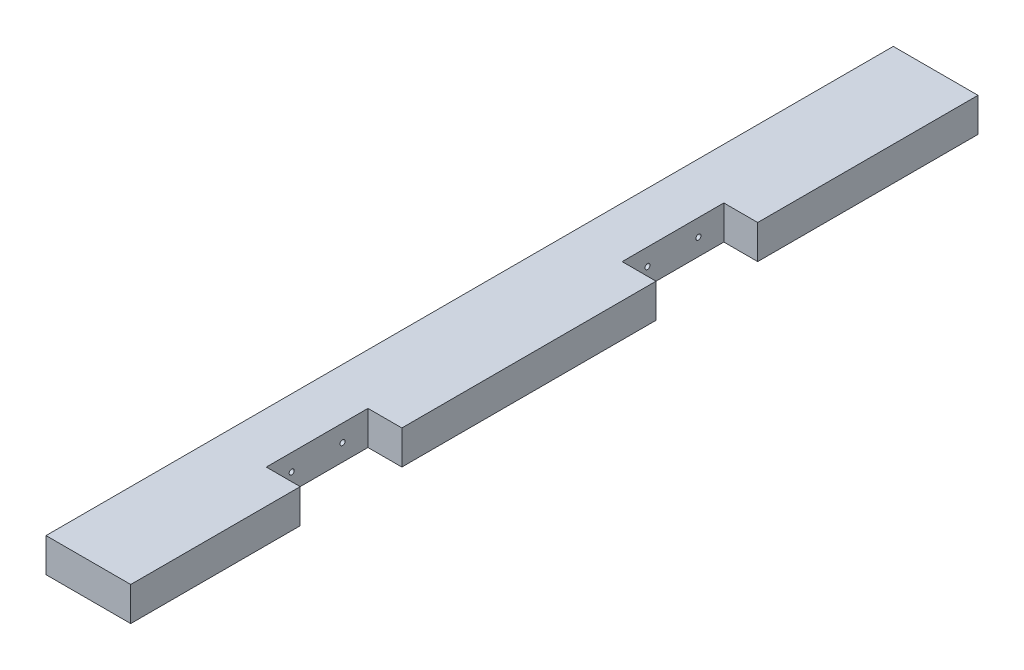
ISO-10303-21;
HEADER;
FILE_DESCRIPTION(('STEP AP214'),'2;1');
FILE_NAME('part.step','',(''),(''),'','','');
FILE_SCHEMA(('AUTOMOTIVE_DESIGN { 1 0 10303 214 1 1 1 1 }'));
ENDSEC;
DATA;
#1=APPLICATION_CONTEXT('core data for automotive mechanical design processes');
#2=APPLICATION_PROTOCOL_DEFINITION('international standard','automotive_design',2000,#1);
#3=PRODUCT_CONTEXT('',#1,'mechanical');
#4=PRODUCT('Part','Part','',(#3));
#5=PRODUCT_RELATED_PRODUCT_CATEGORY('part','',(#4));
#6=PRODUCT_DEFINITION_FORMATION('','',#4);
#7=PRODUCT_DEFINITION_CONTEXT('part definition',#1,'design');
#8=PRODUCT_DEFINITION('design','',#6,#7);
#9=PRODUCT_DEFINITION_SHAPE('','',#8);
#10=(LENGTH_UNIT() NAMED_UNIT(*) SI_UNIT(.MILLI.,.METRE.));
#11=(NAMED_UNIT(*) PLANE_ANGLE_UNIT() SI_UNIT($,.RADIAN.));
#12=(NAMED_UNIT(*) SI_UNIT($,.STERADIAN.) SOLID_ANGLE_UNIT());
#13=UNCERTAINTY_MEASURE_WITH_UNIT(LENGTH_MEASURE(1.E-05),#10,'distance_accuracy_value','');
#14=(GEOMETRIC_REPRESENTATION_CONTEXT(3) GLOBAL_UNCERTAINTY_ASSIGNED_CONTEXT((#13)) GLOBAL_UNIT_ASSIGNED_CONTEXT((#10,
#11,#12)) REPRESENTATION_CONTEXT('',''));
#15=CARTESIAN_POINT('',(0.,0.,0.));
#16=DIRECTION('',(0.,0.,1.));
#17=DIRECTION('',(1.,0.,0.));
#18=AXIS2_PLACEMENT_3D('',#15,#16,#17);
#19=CARTESIAN_POINT('',(25.,10.,500.));
#20=DIRECTION('',(-1.,0.,0.));
#21=DIRECTION('',(0.,-1.,0.));
#22=AXIS2_PLACEMENT_3D('',#19,#20,#21);
#23=PLANE('',#22);
#24=DIRECTION('',(0.,0.,-1.));
#25=VECTOR('',#24,1.);
#26=CARTESIAN_POINT('',(25.,-10.,500.));
#27=LINE('',#26,#25);
#28=CARTESIAN_POINT('',(25.,-10.,340.));
#29=VERTEX_POINT('',#28);
#30=CARTESIAN_POINT('',(25.,-10.,190.));
#31=VERTEX_POINT('',#30);
#32=EDGE_CURVE('E144',#29,#31,#27,.T.);
#33=ORIENTED_EDGE('',*,*,#32,.T.);
#34=DIRECTION('',(0.,1.,0.));
#35=VECTOR('',#34,1.);
#36=CARTESIAN_POINT('',(25.,-10.,190.));
#37=LINE('',#36,#35);
#38=CARTESIAN_POINT('',(25.,10.,190.));
#39=VERTEX_POINT('',#38);
#40=EDGE_CURVE('E183',#31,#39,#37,.T.);
#41=ORIENTED_EDGE('',*,*,#40,.T.);
#42=DIRECTION('',(0.,0.,-1.));
#43=VECTOR('',#42,1.);
#44=CARTESIAN_POINT('',(25.,10.,500.));
#45=LINE('',#44,#43);
#46=CARTESIAN_POINT('',(25.,10.,340.));
#47=VERTEX_POINT('',#46);
#48=EDGE_CURVE('E40',#47,#39,#45,.T.);
#49=ORIENTED_EDGE('',*,*,#48,.F.);
#50=DIRECTION('',(0.,1.,0.));
#51=VECTOR('',#50,1.);
#52=CARTESIAN_POINT('',(25.,-10.,340.));
#53=LINE('',#52,#51);
#54=EDGE_CURVE('E181',#29,#47,#53,.T.);
#55=ORIENTED_EDGE('',*,*,#54,.F.);
#56=EDGE_LOOP('',(#33,#41,#49,#55));
#57=FACE_BOUND('',#56,.T.);
#58=ADVANCED_FACE('F32',(#57),#23,.F.);
#59=CARTESIAN_POINT('',(25.,-10.,500.));
#60=VERTEX_POINT('',#59);
#61=CARTESIAN_POINT('',(25.,-10.,400.));
#62=VERTEX_POINT('',#61);
#63=EDGE_CURVE('E147',#60,#62,#27,.T.);
#64=ORIENTED_EDGE('',*,*,#63,.T.);
#65=DIRECTION('',(0.,1.,0.));
#66=VECTOR('',#65,1.);
#67=CARTESIAN_POINT('',(25.,-10.,400.));
#68=LINE('',#67,#66);
#69=CARTESIAN_POINT('',(25.,10.,400.));
#70=VERTEX_POINT('',#69);
#71=EDGE_CURVE('E207',#62,#70,#68,.T.);
#72=ORIENTED_EDGE('',*,*,#71,.T.);
#73=CARTESIAN_POINT('',(25.,10.,500.));
#74=VERTEX_POINT('',#73);
#75=EDGE_CURVE('E11',#74,#70,#45,.T.);
#76=ORIENTED_EDGE('',*,*,#75,.F.);
#77=DIRECTION('',(0.,1.,0.));
#78=VECTOR('',#77,1.);
#79=CARTESIAN_POINT('',(25.,10.,500.));
#80=LINE('',#79,#78);
#81=EDGE_CURVE('E215',#60,#74,#80,.T.);
#82=ORIENTED_EDGE('',*,*,#81,.F.);
#83=EDGE_LOOP('',(#64,#72,#76,#82));
#84=FACE_BOUND('',#83,.T.);
#85=ADVANCED_FACE('F231',(#84),#23,.F.);
#86=CARTESIAN_POINT('',(25.,10.,130.));
#87=VERTEX_POINT('',#86);
#88=CARTESIAN_POINT('',(25.,10.,0.));
#89=VERTEX_POINT('',#88);
#90=EDGE_CURVE('E41',#87,#89,#45,.T.);
#91=ORIENTED_EDGE('',*,*,#90,.F.);
#92=DIRECTION('',(0.,1.,0.));
#93=VECTOR('',#92,1.);
#94=CARTESIAN_POINT('',(25.,-10.,130.));
#95=LINE('',#94,#93);
#96=CARTESIAN_POINT('',(25.,-10.,130.));
#97=VERTEX_POINT('',#96);
#98=EDGE_CURVE('E125',#97,#87,#95,.T.);
#99=ORIENTED_EDGE('',*,*,#98,.F.);
#100=CARTESIAN_POINT('',(25.,-10.,0.));
#101=VERTEX_POINT('',#100);
#102=EDGE_CURVE('E135',#97,#101,#27,.T.);
#103=ORIENTED_EDGE('',*,*,#102,.T.);
#104=DIRECTION('',(0.,1.,0.));
#105=VECTOR('',#104,1.);
#106=CARTESIAN_POINT('',(25.,10.,0.));
#107=LINE('',#106,#105);
#108=EDGE_CURVE('E209',#101,#89,#107,.T.);
#109=ORIENTED_EDGE('',*,*,#108,.T.);
#110=EDGE_LOOP('',(#91,#99,#103,#109));
#111=FACE_BOUND('',#110,.T.);
#112=ADVANCED_FACE('F34',(#111),#23,.F.);
#113=CARTESIAN_POINT('',(-25.,10.,500.));
#114=DIRECTION('',(0.,-1.,0.));
#115=DIRECTION('',(0.,0.,-1.));
#116=AXIS2_PLACEMENT_3D('',#113,#114,#115);
#117=PLANE('',#116);
#118=ORIENTED_EDGE('',*,*,#48,.T.);
#119=DIRECTION('',(1.,0.,0.));
#120=VECTOR('',#119,1.);
#121=CARTESIAN_POINT('',(25.,10.,190.));
#122=LINE('',#121,#120);
#123=CARTESIAN_POINT('',(4.99999999999998,10.,190.));
#124=VERTEX_POINT('',#123);
#125=EDGE_CURVE('E130',#124,#39,#122,.T.);
#126=ORIENTED_EDGE('',*,*,#125,.F.);
#127=DIRECTION('',(0.,0.,1.));
#128=VECTOR('',#127,1.);
#129=CARTESIAN_POINT('',(4.99999999999998,10.,130.));
#130=LINE('',#129,#128);
#131=CARTESIAN_POINT('',(4.99999999999998,10.,130.));
#132=VERTEX_POINT('',#131);
#133=EDGE_CURVE('E243',#132,#124,#130,.T.);
#134=ORIENTED_EDGE('',*,*,#133,.F.);
#135=DIRECTION('',(-1.,0.,0.));
#136=VECTOR('',#135,1.);
#137=CARTESIAN_POINT('',(25.,10.,130.));
#138=LINE('',#137,#136);
#139=EDGE_CURVE('E242',#87,#132,#138,.T.);
#140=ORIENTED_EDGE('',*,*,#139,.F.);
#141=ORIENTED_EDGE('',*,*,#90,.T.);
#142=DIRECTION('',(-1.,0.,0.));
#143=VECTOR('',#142,1.);
#144=CARTESIAN_POINT('',(-25.,10.,0.));
#145=LINE('',#144,#143);
#146=CARTESIAN_POINT('',(-25.,10.,0.));
#147=VERTEX_POINT('',#146);
#148=EDGE_CURVE('E222',#89,#147,#145,.T.);
#149=ORIENTED_EDGE('',*,*,#148,.T.);
#150=DIRECTION('',(0.,0.,-1.));
#151=VECTOR('',#150,1.);
#152=CARTESIAN_POINT('',(-25.,10.,500.));
#153=LINE('',#152,#151);
#154=CARTESIAN_POINT('',(-25.,10.,500.));
#155=VERTEX_POINT('',#154);
#156=EDGE_CURVE('E159',#155,#147,#153,.T.);
#157=ORIENTED_EDGE('',*,*,#156,.F.);
#158=DIRECTION('',(-1.,0.,0.));
#159=VECTOR('',#158,1.);
#160=CARTESIAN_POINT('',(-25.,10.,500.));
#161=LINE('',#160,#159);
#162=EDGE_CURVE('E218',#74,#155,#161,.T.);
#163=ORIENTED_EDGE('',*,*,#162,.F.);
#164=ORIENTED_EDGE('',*,*,#75,.T.);
#165=DIRECTION('',(1.,0.,0.));
#166=VECTOR('',#165,1.);
#167=CARTESIAN_POINT('',(25.,10.,400.));
#168=LINE('',#167,#166);
#169=CARTESIAN_POINT('',(5.00000000000001,10.,400.));
#170=VERTEX_POINT('',#169);
#171=EDGE_CURVE('E199',#170,#70,#168,.T.);
#172=ORIENTED_EDGE('',*,*,#171,.F.);
#173=DIRECTION('',(0.,0.,1.));
#174=VECTOR('',#173,1.);
#175=CARTESIAN_POINT('',(5.,10.,340.));
#176=LINE('',#175,#174);
#177=CARTESIAN_POINT('',(5.,10.,340.));
#178=VERTEX_POINT('',#177);
#179=EDGE_CURVE('E189',#178,#170,#176,.T.);
#180=ORIENTED_EDGE('',*,*,#179,.F.);
#181=DIRECTION('',(-1.,0.,0.));
#182=VECTOR('',#181,1.);
#183=CARTESIAN_POINT('',(25.,10.,340.));
#184=LINE('',#183,#182);
#185=EDGE_CURVE('E177',#47,#178,#184,.T.);
#186=ORIENTED_EDGE('',*,*,#185,.F.);
#187=EDGE_LOOP('',(#118,#126,#134,#140,#141,#149,#157,#163,#164,#172,#180,#186));
#188=FACE_BOUND('',#187,.T.);
#189=ADVANCED_FACE('F173',(#188),#117,.F.);
#190=CARTESIAN_POINT('',(-25.,10.,500.));
#191=DIRECTION('',(1.,0.,0.));
#192=DIRECTION('',(0.,1.,0.));
#193=AXIS2_PLACEMENT_3D('',#190,#191,#192);
#194=PLANE('',#193);
#195=DIRECTION('',(0.,-1.,0.));
#196=VECTOR('',#195,1.);
#197=CARTESIAN_POINT('',(-25.,10.,0.));
#198=LINE('',#197,#196);
#199=CARTESIAN_POINT('',(-25.,-10.,0.));
#200=VERTEX_POINT('',#199);
#201=EDGE_CURVE('E224',#147,#200,#198,.T.);
#202=ORIENTED_EDGE('',*,*,#201,.T.);
#203=DIRECTION('',(0.,0.,-1.));
#204=VECTOR('',#203,1.);
#205=CARTESIAN_POINT('',(-25.,-10.,500.));
#206=LINE('',#205,#204);
#207=CARTESIAN_POINT('',(-25.,-10.,500.));
#208=VERTEX_POINT('',#207);
#209=EDGE_CURVE('E154',#208,#200,#206,.T.);
#210=ORIENTED_EDGE('',*,*,#209,.F.);
#211=DIRECTION('',(0.,-1.,0.));
#212=VECTOR('',#211,1.);
#213=CARTESIAN_POINT('',(-25.,10.,500.));
#214=LINE('',#213,#212);
#215=EDGE_CURVE('E149',#155,#208,#214,.T.);
#216=ORIENTED_EDGE('',*,*,#215,.F.);
#217=ORIENTED_EDGE('',*,*,#156,.T.);
#218=EDGE_LOOP('',(#202,#210,#216,#217));
#219=FACE_BOUND('',#218,.T.);
#220=ADVANCED_FACE('F225',(#219),#194,.F.);
#221=CARTESIAN_POINT('',(-25.,-10.,500.));
#222=DIRECTION('',(0.,1.,0.));
#223=DIRECTION('',(0.,0.,1.));
#224=AXIS2_PLACEMENT_3D('',#221,#222,#223);
#225=PLANE('',#224);
#226=DIRECTION('',(0.,0.,1.));
#227=VECTOR('',#226,1.);
#228=CARTESIAN_POINT('',(4.99999999999998,-10.,130.));
#229=LINE('',#228,#227);
#230=CARTESIAN_POINT('',(4.99999999999998,-10.,130.));
#231=VERTEX_POINT('',#230);
#232=CARTESIAN_POINT('',(4.99999999999998,-10.,190.));
#233=VERTEX_POINT('',#232);
#234=EDGE_CURVE('E48',#231,#233,#229,.T.);
#235=ORIENTED_EDGE('',*,*,#234,.T.);
#236=DIRECTION('',(1.,0.,0.));
#237=VECTOR('',#236,1.);
#238=CARTESIAN_POINT('',(25.,-10.,190.));
#239=LINE('',#238,#237);
#240=EDGE_CURVE('E137',#233,#31,#239,.T.);
#241=ORIENTED_EDGE('',*,*,#240,.T.);
#242=ORIENTED_EDGE('',*,*,#32,.F.);
#243=DIRECTION('',(-1.,0.,0.));
#244=VECTOR('',#243,1.);
#245=CARTESIAN_POINT('',(25.,-10.,340.));
#246=LINE('',#245,#244);
#247=CARTESIAN_POINT('',(5.,-10.,340.));
#248=VERTEX_POINT('',#247);
#249=EDGE_CURVE('E196',#29,#248,#246,.T.);
#250=ORIENTED_EDGE('',*,*,#249,.T.);
#251=DIRECTION('',(0.,0.,1.));
#252=VECTOR('',#251,1.);
#253=CARTESIAN_POINT('',(5.,-10.,340.));
#254=LINE('',#253,#252);
#255=CARTESIAN_POINT('',(5.00000000000001,-10.,400.));
#256=VERTEX_POINT('',#255);
#257=EDGE_CURVE('E56',#248,#256,#254,.T.);
#258=ORIENTED_EDGE('',*,*,#257,.T.);
#259=DIRECTION('',(1.,0.,0.));
#260=VECTOR('',#259,1.);
#261=CARTESIAN_POINT('',(25.,-10.,400.));
#262=LINE('',#261,#260);
#263=EDGE_CURVE('E201',#256,#62,#262,.T.);
#264=ORIENTED_EDGE('',*,*,#263,.T.);
#265=ORIENTED_EDGE('',*,*,#63,.F.);
#266=DIRECTION('',(1.,0.,0.));
#267=VECTOR('',#266,1.);
#268=CARTESIAN_POINT('',(-25.,-10.,500.));
#269=LINE('',#268,#267);
#270=EDGE_CURVE('E145',#208,#60,#269,.T.);
#271=ORIENTED_EDGE('',*,*,#270,.F.);
#272=ORIENTED_EDGE('',*,*,#209,.T.);
#273=DIRECTION('',(1.,0.,0.));
#274=VECTOR('',#273,1.);
#275=CARTESIAN_POINT('',(-25.,-10.,0.));
#276=LINE('',#275,#274);
#277=EDGE_CURVE('E142',#200,#101,#276,.T.);
#278=ORIENTED_EDGE('',*,*,#277,.T.);
#279=ORIENTED_EDGE('',*,*,#102,.F.);
#280=DIRECTION('',(-1.,0.,0.));
#281=VECTOR('',#280,1.);
#282=CARTESIAN_POINT('',(25.,-10.,130.));
#283=LINE('',#282,#281);
#284=EDGE_CURVE('E121',#97,#231,#283,.T.);
#285=ORIENTED_EDGE('',*,*,#284,.T.);
#286=EDGE_LOOP('',(#235,#241,#242,#250,#258,#264,#265,#271,#272,#278,#279,#285));
#287=FACE_BOUND('',#286,.T.);
#288=ADVANCED_FACE('F139',(#287),#225,.F.);
#289=CARTESIAN_POINT('',(0.,0.,500.));
#290=DIRECTION('',(0.,0.,1.));
#291=DIRECTION('',(1.,0.,0.));
#292=AXIS2_PLACEMENT_3D('',#289,#290,#291);
#293=PLANE('',#292);
#294=ORIENTED_EDGE('',*,*,#81,.T.);
#295=ORIENTED_EDGE('',*,*,#162,.T.);
#296=ORIENTED_EDGE('',*,*,#215,.T.);
#297=ORIENTED_EDGE('',*,*,#270,.T.);
#298=EDGE_LOOP('',(#294,#295,#296,#297));
#299=FACE_BOUND('',#298,.T.);
#300=ADVANCED_FACE('F229',(#299),#293,.T.);
#301=CARTESIAN_POINT('',(0.,0.,0.));
#302=DIRECTION('',(0.,0.,1.));
#303=DIRECTION('',(1.,0.,0.));
#304=AXIS2_PLACEMENT_3D('',#301,#302,#303);
#305=PLANE('',#304);
#306=ORIENTED_EDGE('',*,*,#108,.F.);
#307=ORIENTED_EDGE('',*,*,#277,.F.);
#308=ORIENTED_EDGE('',*,*,#201,.F.);
#309=ORIENTED_EDGE('',*,*,#148,.F.);
#310=EDGE_LOOP('',(#306,#307,#308,#309));
#311=FACE_BOUND('',#310,.T.);
#312=ADVANCED_FACE('F227',(#311),#305,.F.);
#313=CARTESIAN_POINT('',(25.,-10.,400.));
#314=DIRECTION('',(0.,0.,1.));
#315=DIRECTION('',(1.,0.,0.));
#316=AXIS2_PLACEMENT_3D('',#313,#314,#315);
#317=PLANE('',#316);
#318=ORIENTED_EDGE('',*,*,#171,.T.);
#319=ORIENTED_EDGE('',*,*,#71,.F.);
#320=ORIENTED_EDGE('',*,*,#263,.F.);
#321=DIRECTION('',(0.,1.,0.));
#322=VECTOR('',#321,1.);
#323=CARTESIAN_POINT('',(5.00000000000001,-10.,400.));
#324=LINE('',#323,#322);
#325=EDGE_CURVE('E210',#256,#170,#324,.T.);
#326=ORIENTED_EDGE('',*,*,#325,.T.);
#327=EDGE_LOOP('',(#318,#319,#320,#326));
#328=FACE_BOUND('',#327,.T.);
#329=ADVANCED_FACE('F234',(#328),#317,.F.);
#330=CARTESIAN_POINT('',(5.,-10.,340.));
#331=DIRECTION('',(-1.,0.,0.));
#332=DIRECTION('',(0.,0.,1.));
#333=AXIS2_PLACEMENT_3D('',#330,#331,#332);
#334=PLANE('',#333);
#335=CARTESIAN_POINT('',(5.00000000000001,0.,355.));
#336=DIRECTION('',(1.,0.,0.));
#337=DIRECTION('',(0.,0.,-1.));
#338=AXIS2_PLACEMENT_3D('',#335,#336,#337);
#339=CIRCLE('',#338,1.50000000000002);
#340=CARTESIAN_POINT('',(5.00000000000001,0.,353.5));
#341=VERTEX_POINT('',#340);
#342=EDGE_CURVE('E396',#341,#341,#339,.T.);
#343=ORIENTED_EDGE('',*,*,#342,.F.);
#344=EDGE_LOOP('',(#343));
#345=FACE_BOUND('',#344,.T.);
#346=CARTESIAN_POINT('',(5.00000000000001,0.,385.));
#347=DIRECTION('',(1.,0.,0.));
#348=DIRECTION('',(0.,0.,-1.));
#349=AXIS2_PLACEMENT_3D('',#346,#347,#348);
#350=CIRCLE('',#349,1.50000000000002);
#351=CARTESIAN_POINT('',(5.00000000000001,0.,383.5));
#352=VERTEX_POINT('',#351);
#353=EDGE_CURVE('E395',#352,#352,#350,.T.);
#354=ORIENTED_EDGE('',*,*,#353,.F.);
#355=EDGE_LOOP('',(#354));
#356=FACE_BOUND('',#355,.T.);
#357=ORIENTED_EDGE('',*,*,#179,.T.);
#358=ORIENTED_EDGE('',*,*,#325,.F.);
#359=ORIENTED_EDGE('',*,*,#257,.F.);
#360=DIRECTION('',(0.,1.,0.));
#361=VECTOR('',#360,1.);
#362=CARTESIAN_POINT('',(5.,-10.,340.));
#363=LINE('',#362,#361);
#364=EDGE_CURVE('E212',#248,#178,#363,.T.);
#365=ORIENTED_EDGE('',*,*,#364,.T.);
#366=EDGE_LOOP('',(#357,#358,#359,#365));
#367=FACE_BOUND('',#366,.T.);
#368=ADVANCED_FACE('F236',(#345,#356,#367),#334,.F.);
#369=CARTESIAN_POINT('',(25.,-10.,340.));
#370=DIRECTION('',(0.,0.,-1.));
#371=DIRECTION('',(-1.,0.,0.));
#372=AXIS2_PLACEMENT_3D('',#369,#370,#371);
#373=PLANE('',#372);
#374=ORIENTED_EDGE('',*,*,#185,.T.);
#375=ORIENTED_EDGE('',*,*,#364,.F.);
#376=ORIENTED_EDGE('',*,*,#249,.F.);
#377=ORIENTED_EDGE('',*,*,#54,.T.);
#378=EDGE_LOOP('',(#374,#375,#376,#377));
#379=FACE_BOUND('',#378,.T.);
#380=ADVANCED_FACE('F238',(#379),#373,.F.);
#381=CARTESIAN_POINT('',(25.,-10.,190.));
#382=DIRECTION('',(0.,0.,1.));
#383=DIRECTION('',(1.,0.,0.));
#384=AXIS2_PLACEMENT_3D('',#381,#382,#383);
#385=PLANE('',#384);
#386=ORIENTED_EDGE('',*,*,#125,.T.);
#387=ORIENTED_EDGE('',*,*,#40,.F.);
#388=ORIENTED_EDGE('',*,*,#240,.F.);
#389=DIRECTION('',(0.,1.,0.));
#390=VECTOR('',#389,1.);
#391=CARTESIAN_POINT('',(4.99999999999998,-10.,190.));
#392=LINE('',#391,#390);
#393=EDGE_CURVE('E187',#233,#124,#392,.T.);
#394=ORIENTED_EDGE('',*,*,#393,.T.);
#395=EDGE_LOOP('',(#386,#387,#388,#394));
#396=FACE_BOUND('',#395,.T.);
#397=ADVANCED_FACE('F246',(#396),#385,.F.);
#398=CARTESIAN_POINT('',(4.99999999999998,-10.,130.));
#399=DIRECTION('',(-1.,0.,0.));
#400=DIRECTION('',(0.,0.,1.));
#401=AXIS2_PLACEMENT_3D('',#398,#399,#400);
#402=PLANE('',#401);
#403=CARTESIAN_POINT('',(4.99999999999999,0.,175.));
#404=DIRECTION('',(1.,0.,0.));
#405=DIRECTION('',(0.,0.,-1.));
#406=AXIS2_PLACEMENT_3D('',#403,#404,#405);
#407=CIRCLE('',#406,1.5);
#408=CARTESIAN_POINT('',(4.99999999999999,0.,173.5));
#409=VERTEX_POINT('',#408);
#410=EDGE_CURVE('E406',#409,#409,#407,.T.);
#411=ORIENTED_EDGE('',*,*,#410,.F.);
#412=EDGE_LOOP('',(#411));
#413=FACE_BOUND('',#412,.T.);
#414=CARTESIAN_POINT('',(4.99999999999998,0.,145.));
#415=DIRECTION('',(1.,0.,0.));
#416=DIRECTION('',(0.,0.,-1.));
#417=AXIS2_PLACEMENT_3D('',#414,#415,#416);
#418=CIRCLE('',#417,1.5);
#419=CARTESIAN_POINT('',(4.99999999999998,0.,143.5));
#420=VERTEX_POINT('',#419);
#421=EDGE_CURVE('E412',#420,#420,#418,.T.);
#422=ORIENTED_EDGE('',*,*,#421,.F.);
#423=EDGE_LOOP('',(#422));
#424=FACE_BOUND('',#423,.T.);
#425=ORIENTED_EDGE('',*,*,#133,.T.);
#426=ORIENTED_EDGE('',*,*,#393,.F.);
#427=ORIENTED_EDGE('',*,*,#234,.F.);
#428=DIRECTION('',(0.,1.,0.));
#429=VECTOR('',#428,1.);
#430=CARTESIAN_POINT('',(4.99999999999998,-10.,130.));
#431=LINE('',#430,#429);
#432=EDGE_CURVE('E127',#231,#132,#431,.T.);
#433=ORIENTED_EDGE('',*,*,#432,.T.);
#434=EDGE_LOOP('',(#425,#426,#427,#433));
#435=FACE_BOUND('',#434,.T.);
#436=ADVANCED_FACE('F247',(#413,#424,#435),#402,.F.);
#437=CARTESIAN_POINT('',(25.,-10.,130.));
#438=DIRECTION('',(0.,0.,-1.));
#439=DIRECTION('',(-1.,0.,0.));
#440=AXIS2_PLACEMENT_3D('',#437,#438,#439);
#441=PLANE('',#440);
#442=ORIENTED_EDGE('',*,*,#139,.T.);
#443=ORIENTED_EDGE('',*,*,#432,.F.);
#444=ORIENTED_EDGE('',*,*,#284,.F.);
#445=ORIENTED_EDGE('',*,*,#98,.T.);
#446=EDGE_LOOP('',(#442,#443,#444,#445));
#447=FACE_BOUND('',#446,.T.);
#448=ADVANCED_FACE('F124',(#447),#441,.F.);
#449=CARTESIAN_POINT('',(-15.,0.,385.));
#450=DIRECTION('',(1.,0.,0.));
#451=DIRECTION('',(0.,0.,-1.));
#452=AXIS2_PLACEMENT_3D('',#449,#450,#451);
#453=CYLINDRICAL_SURFACE('',#452,1.50000000000002);
#454=CARTESIAN_POINT('',(-15.,0.,385.));
#455=DIRECTION('',(1.,0.,0.));
#456=DIRECTION('',(0.,0.,-1.));
#457=AXIS2_PLACEMENT_3D('',#454,#455,#456);
#458=CIRCLE('',#457,1.50000000000002);
#459=CARTESIAN_POINT('',(-15.,0.,383.5));
#460=VERTEX_POINT('',#459);
#461=EDGE_CURVE('E244',#460,#460,#458,.T.);
#462=ORIENTED_EDGE('',*,*,#461,.F.);
#463=EDGE_LOOP('',(#462));
#464=FACE_BOUND('',#463,.T.);
#465=ORIENTED_EDGE('',*,*,#353,.T.);
#466=EDGE_LOOP('',(#465));
#467=FACE_BOUND('',#466,.T.);
#468=ADVANCED_FACE('F255',(#464,#467),#453,.F.);
#469=CARTESIAN_POINT('',(-15.,0.,385.));
#470=DIRECTION('',(1.,0.,0.));
#471=DIRECTION('',(0.,0.,-1.));
#472=AXIS2_PLACEMENT_3D('',#469,#470,#471);
#473=PLANE('',#472);
#474=ORIENTED_EDGE('',*,*,#461,.T.);
#475=EDGE_LOOP('',(#474));
#476=FACE_BOUND('',#475,.T.);
#477=ADVANCED_FACE('F318',(#476),#473,.T.);
#478=CARTESIAN_POINT('',(-15.,0.,145.));
#479=DIRECTION('',(1.,0.,0.));
#480=DIRECTION('',(0.,0.,-1.));
#481=AXIS2_PLACEMENT_3D('',#478,#479,#480);
#482=CYLINDRICAL_SURFACE('',#481,1.5);
#483=CARTESIAN_POINT('',(-15.,0.,145.));
#484=DIRECTION('',(1.,0.,0.));
#485=DIRECTION('',(0.,0.,-1.));
#486=AXIS2_PLACEMENT_3D('',#483,#484,#485);
#487=CIRCLE('',#486,1.5);
#488=CARTESIAN_POINT('',(-15.,0.,143.5));
#489=VERTEX_POINT('',#488);
#490=EDGE_CURVE('E409',#489,#489,#487,.T.);
#491=ORIENTED_EDGE('',*,*,#490,.F.);
#492=EDGE_LOOP('',(#491));
#493=FACE_BOUND('',#492,.T.);
#494=ORIENTED_EDGE('',*,*,#421,.T.);
#495=EDGE_LOOP('',(#494));
#496=FACE_BOUND('',#495,.T.);
#497=ADVANCED_FACE('F325',(#493,#496),#482,.F.);
#498=CARTESIAN_POINT('',(-15.,0.,145.));
#499=DIRECTION('',(1.,0.,0.));
#500=DIRECTION('',(0.,0.,-1.));
#501=AXIS2_PLACEMENT_3D('',#498,#499,#500);
#502=PLANE('',#501);
#503=ORIENTED_EDGE('',*,*,#490,.T.);
#504=EDGE_LOOP('',(#503));
#505=FACE_BOUND('',#504,.T.);
#506=ADVANCED_FACE('F333',(#505),#502,.T.);
#507=CARTESIAN_POINT('',(-15.,0.,175.));
#508=DIRECTION('',(1.,0.,0.));
#509=DIRECTION('',(0.,0.,-1.));
#510=AXIS2_PLACEMENT_3D('',#507,#508,#509);
#511=CYLINDRICAL_SURFACE('',#510,1.5);
#512=CARTESIAN_POINT('',(-15.,0.,175.));
#513=DIRECTION('',(1.,0.,0.));
#514=DIRECTION('',(0.,0.,-1.));
#515=AXIS2_PLACEMENT_3D('',#512,#513,#514);
#516=CIRCLE('',#515,1.5);
#517=CARTESIAN_POINT('',(-15.,0.,173.5));
#518=VERTEX_POINT('',#517);
#519=EDGE_CURVE('E401',#518,#518,#516,.T.);
#520=ORIENTED_EDGE('',*,*,#519,.F.);
#521=EDGE_LOOP('',(#520));
#522=FACE_BOUND('',#521,.T.);
#523=ORIENTED_EDGE('',*,*,#410,.T.);
#524=EDGE_LOOP('',(#523));
#525=FACE_BOUND('',#524,.T.);
#526=ADVANCED_FACE('F341',(#522,#525),#511,.F.);
#527=CARTESIAN_POINT('',(-15.,0.,175.));
#528=DIRECTION('',(1.,0.,0.));
#529=DIRECTION('',(0.,0.,-1.));
#530=AXIS2_PLACEMENT_3D('',#527,#528,#529);
#531=PLANE('',#530);
#532=ORIENTED_EDGE('',*,*,#519,.T.);
#533=EDGE_LOOP('',(#532));
#534=FACE_BOUND('',#533,.T.);
#535=ADVANCED_FACE('F349',(#534),#531,.T.);
#536=CARTESIAN_POINT('',(-15.,0.,355.));
#537=DIRECTION('',(1.,0.,0.));
#538=DIRECTION('',(0.,0.,-1.));
#539=AXIS2_PLACEMENT_3D('',#536,#537,#538);
#540=CYLINDRICAL_SURFACE('',#539,1.50000000000002);
#541=CARTESIAN_POINT('',(-15.,0.,355.));
#542=DIRECTION('',(1.,0.,0.));
#543=DIRECTION('',(0.,0.,-1.));
#544=AXIS2_PLACEMENT_3D('',#541,#542,#543);
#545=CIRCLE('',#544,1.50000000000002);
#546=CARTESIAN_POINT('',(-15.,0.,353.5));
#547=VERTEX_POINT('',#546);
#548=EDGE_CURVE('E394',#547,#547,#545,.T.);
#549=ORIENTED_EDGE('',*,*,#548,.F.);
#550=EDGE_LOOP('',(#549));
#551=FACE_BOUND('',#550,.T.);
#552=ORIENTED_EDGE('',*,*,#342,.T.);
#553=EDGE_LOOP('',(#552));
#554=FACE_BOUND('',#553,.T.);
#555=ADVANCED_FACE('F357',(#551,#554),#540,.F.);
#556=CARTESIAN_POINT('',(-15.,0.,355.));
#557=DIRECTION('',(1.,0.,0.));
#558=DIRECTION('',(0.,0.,-1.));
#559=AXIS2_PLACEMENT_3D('',#556,#557,#558);
#560=PLANE('',#559);
#561=ORIENTED_EDGE('',*,*,#548,.T.);
#562=EDGE_LOOP('',(#561));
#563=FACE_BOUND('',#562,.T.);
#564=ADVANCED_FACE('F365',(#563),#560,.T.);
#565=CLOSED_SHELL('',(#58,#85,#112,#189,#220,#288,#300,#312,#329,#368,#380,#397,#436,#448,#468,
#477,#497,#506,#526,#535,#555,#564));
#566=MANIFOLD_SOLID_BREP('B2',#565);
#567=ADVANCED_BREP_SHAPE_REPRESENTATION('',(#18,#566),#14);
#568=SHAPE_DEFINITION_REPRESENTATION(#9,#567);
ENDSEC;
END-ISO-10303-21;
